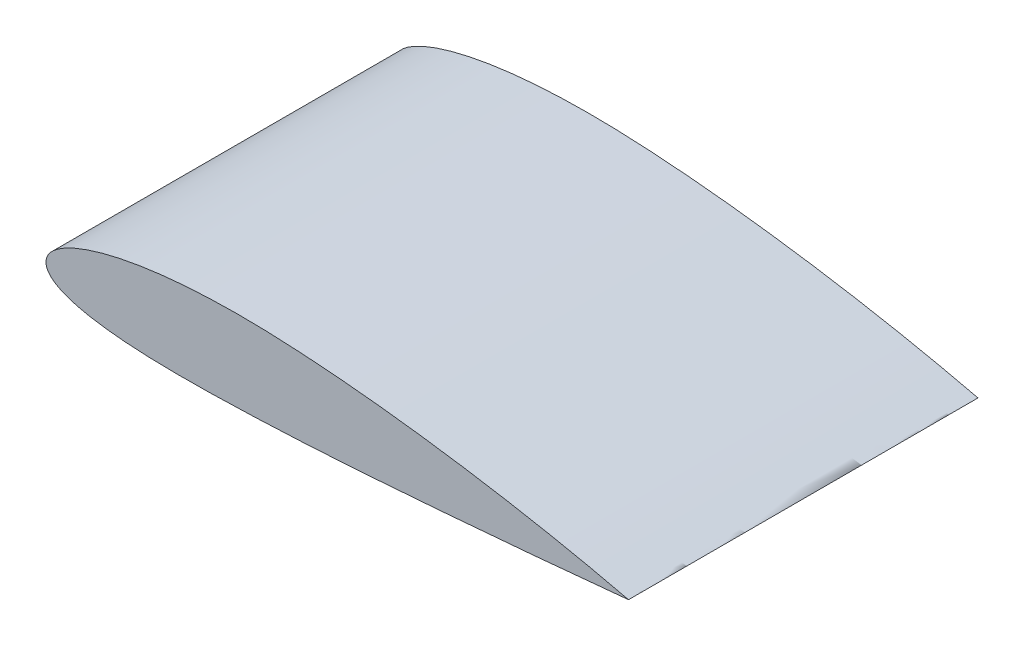
ISO-10303-21;
HEADER;
FILE_DESCRIPTION(('STEP AP214'),'2;1');
FILE_NAME('part.step','',(''),(''),'','','');
FILE_SCHEMA(('AUTOMOTIVE_DESIGN { 1 0 10303 214 1 1 1 1 }'));
ENDSEC;
DATA;
#1=APPLICATION_CONTEXT('core data for automotive mechanical design processes');
#2=APPLICATION_PROTOCOL_DEFINITION('international standard','automotive_design',2000,#1);
#3=PRODUCT_CONTEXT('',#1,'mechanical');
#4=PRODUCT('Part','Part','',(#3));
#5=PRODUCT_RELATED_PRODUCT_CATEGORY('part','',(#4));
#6=PRODUCT_DEFINITION_FORMATION('','',#4);
#7=PRODUCT_DEFINITION_CONTEXT('part definition',#1,'design');
#8=PRODUCT_DEFINITION('design','',#6,#7);
#9=PRODUCT_DEFINITION_SHAPE('','',#8);
#10=(LENGTH_UNIT() NAMED_UNIT(*) SI_UNIT(.MILLI.,.METRE.));
#11=(NAMED_UNIT(*) PLANE_ANGLE_UNIT() SI_UNIT($,.RADIAN.));
#12=(NAMED_UNIT(*) SI_UNIT($,.STERADIAN.) SOLID_ANGLE_UNIT());
#13=UNCERTAINTY_MEASURE_WITH_UNIT(LENGTH_MEASURE(1.E-05),#10,'distance_accuracy_value','');
#14=(GEOMETRIC_REPRESENTATION_CONTEXT(3) GLOBAL_UNCERTAINTY_ASSIGNED_CONTEXT((#13)) GLOBAL_UNIT_ASSIGNED_CONTEXT((#10,
#11,#12)) REPRESENTATION_CONTEXT('',''));
#15=CARTESIAN_POINT('',(0.,0.,0.));
#16=DIRECTION('',(0.,0.,1.));
#17=DIRECTION('',(1.,0.,0.));
#18=AXIS2_PLACEMENT_3D('',#15,#16,#17);
#19=CARTESIAN_POINT('',(150.,0.,90.));
#20=CARTESIAN_POINT('',(150.000128592394,0.00207197176119054,90.));
#21=CARTESIAN_POINT('',(149.921286381414,0.0156762670839637,90.));
#22=CARTESIAN_POINT('',(149.840618533519,0.0400471952402206,90.));
#23=CARTESIAN_POINT('',(149.641362995043,0.0846186664771811,90.));
#24=CARTESIAN_POINT('',(149.393057546676,0.144576152827126,90.));
#25=CARTESIAN_POINT('',(149.062063465987,0.222816135034551,90.));
#26=CARTESIAN_POINT('',(148.662478931329,0.316997243388393,90.));
#27=CARTESIAN_POINT('',(148.189654994556,0.428301766036534,90.));
#28=CARTESIAN_POINT('',(147.645740063505,0.555312571828343,90.));
#29=CARTESIAN_POINT('',(147.030715545027,0.698487644191383,90.));
#30=CARTESIAN_POINT('',(146.345188073157,0.85678795898993,90.));
#31=CARTESIAN_POINT('',(145.589777166898,1.02991038074003,90.));
#32=CARTESIAN_POINT('',(144.765273715445,1.21771459392687,90.));
#33=CARTESIAN_POINT('',(143.872413979352,1.4194023658718,90.));
#34=CARTESIAN_POINT('',(142.911920265599,1.63423906695701,90.));
#35=CARTESIAN_POINT('',(141.884816232876,1.86190790814578,90.));
#36=CARTESIAN_POINT('',(140.791958890963,2.10143686601098,90.));
#37=CARTESIAN_POINT('',(139.634475666377,2.35270967628724,90.));
#38=CARTESIAN_POINT('',(138.413280736817,2.61445237668105,90.));
#39=CARTESIAN_POINT('',(137.129613155064,2.88632597762713,90.));
#40=CARTESIAN_POINT('',(135.784670535301,3.16743412242775,90.));
#41=CARTESIAN_POINT('',(134.379770639112,3.45735336948529,90.));
#42=CARTESIAN_POINT('',(132.9161360637,3.75496046389908,90.));
#43=CARTESIAN_POINT('',(131.395163864362,4.05968375773513,90.));
#44=CARTESIAN_POINT('',(129.818310411048,4.37060302861979,90.));
#45=CARTESIAN_POINT('',(128.18710134998,4.68735342304156,90.));
#46=CARTESIAN_POINT('',(126.503082814844,5.00886677414356,90.));
#47=CARTESIAN_POINT('',(124.767807151878,5.3341279501105,90.));
#48=CARTESIAN_POINT('',(122.983084740532,5.66315451041354,90.));
#49=CARTESIAN_POINT('',(121.150450210213,5.99407609610609,90.));
#50=CARTESIAN_POINT('',(119.271772564735,6.32701286428955,90.));
#51=CARTESIAN_POINT('',(117.348862248889,6.66101413827002,90.));
#52=CARTESIAN_POINT('',(115.38345288509,6.99488813953102,90.));
#53=CARTESIAN_POINT('',(113.377515944814,7.32824888473106,90.));
#54=CARTESIAN_POINT('',(111.333035335355,7.66026083674251,90.));
#55=CARTESIAN_POINT('',(109.251928889209,7.98996875891814,90.));
#56=CARTESIAN_POINT('',(107.136350406203,8.31691563524391,90.));
#57=CARTESIAN_POINT('',(104.988240728006,8.64001782043545,90.));
#58=CARTESIAN_POINT('',(102.809810878505,8.95888224367585,90.));
#59=CARTESIAN_POINT('',(100.60305139377,9.27240468022896,90.));
#60=CARTESIAN_POINT('',(98.3702639008951,9.58014558520131,90.));
#61=CARTESIAN_POINT('',(96.1135680151674,9.8811461356426,90.));
#62=CARTESIAN_POINT('',(93.8352065817292,10.1745903071041,90.));
#63=CARTESIAN_POINT('',(91.5374067106514,10.4599904941657,90.));
#64=CARTESIAN_POINT('',(89.2224528585404,10.7365279827745,90.));
#65=CARTESIAN_POINT('',(86.8927109391122,11.0035496544728,90.));
#66=CARTESIAN_POINT('',(84.5504337738937,11.2599272016814,90.));
#67=CARTESIAN_POINT('',(82.1980308825486,11.5055028127237,90.));
#68=CARTESIAN_POINT('',(79.8377589899001,11.7392678472883,90.));
#69=CARTESIAN_POINT('',(77.4720193182466,11.9609745220418,90.));
#70=CARTESIAN_POINT('',(75.103116251629,12.1689604901954,90.));
#71=CARTESIAN_POINT('',(72.733570487531,12.3638556733871,90.));
#72=CARTESIAN_POINT('',(70.3656333410541,12.5439619039913,90.));
#73=CARTESIAN_POINT('',(68.0017472286094,12.7091035741317,90.));
#74=CARTESIAN_POINT('',(65.644320807281,12.8589185063334,90.));
#75=CARTESIAN_POINT('',(63.2957800126871,12.9924568527596,90.));
#76=CARTESIAN_POINT('',(60.9541598463589,13.1095348623224,90.));
#77=CARTESIAN_POINT('',(58.6188201340624,13.2091378765701,90.));
#78=CARTESIAN_POINT('',(56.2919620624312,13.2854071035843,90.));
#79=CARTESIAN_POINT('',(53.9804093139093,13.3391488693031,90.));
#80=CARTESIAN_POINT('',(51.6894948060767,13.3695491993917,90.));
#81=CARTESIAN_POINT('',(49.4216752106531,13.3765929469494,90.));
#82=CARTESIAN_POINT('',(47.1793461869603,13.3601495087651,90.));
#83=CARTESIAN_POINT('',(44.9650157088471,13.3198752163367,90.));
#84=CARTESIAN_POINT('',(42.780921966315,13.2563712807262,90.));
#85=CARTESIAN_POINT('',(40.6294653699928,13.1693464700625,90.));
#86=CARTESIAN_POINT('',(38.5129239059003,13.0585667062003,90.));
#87=CARTESIAN_POINT('',(36.4335948969937,12.9251436980446,90.));
#88=CARTESIAN_POINT('',(34.3937380881506,12.7685277743742,90.));
#89=CARTESIAN_POINT('',(32.395439512031,12.5898101224116,90.));
#90=CARTESIAN_POINT('',(30.4409654429754,12.3887240815787,90.));
#91=CARTESIAN_POINT('',(28.532263661356,12.1662858815515,90.));
#92=CARTESIAN_POINT('',(26.6713847284961,11.922938652211,90.));
#93=CARTESIAN_POINT('',(24.8603454665422,11.6588893062561,90.));
#94=CARTESIAN_POINT('',(23.1010027714418,11.3754839646862,90.));
#95=CARTESIAN_POINT('',(21.3952312539354,11.0732307085384,90.));
#96=CARTESIAN_POINT('',(19.7447903882117,10.7525809239843,90.));
#97=CARTESIAN_POINT('',(18.1513100119793,10.4147626842155,90.));
#98=CARTESIAN_POINT('',(16.616465426156,10.0607191244245,90.));
#99=CARTESIAN_POINT('',(15.1418582696448,9.69091716799794,90.));
#100=CARTESIAN_POINT('',(13.7289370226268,9.3067253106132,90.));
#101=CARTESIAN_POINT('',(12.3790231623339,8.90910925951885,90.));
#102=CARTESIAN_POINT('',(11.0936518369081,8.49853491041602,90.));
#103=CARTESIAN_POINT('',(9.87373376587554,8.07694806484605,90.));
#104=CARTESIAN_POINT('',(8.72072521013741,7.64438841006556,90.));
#105=CARTESIAN_POINT('',(7.63543166368263,7.20276088763796,90.));
#106=CARTESIAN_POINT('',(6.61915181968241,6.75219437002339,90.));
#107=CARTESIAN_POINT('',(5.67256428686346,6.29424603821434,90.));
#108=CARTESIAN_POINT('',(4.79642792503662,5.82980259989536,90.));
#109=CARTESIAN_POINT('',(3.99173828864941,5.35939593426927,90.));
#110=CARTESIAN_POINT('',(3.2588659990024,4.88433864903243,90.));
#111=CARTESIAN_POINT('',(2.59855787710264,4.40520869694353,90.));
#112=CARTESIAN_POINT('',(2.01123439575519,3.92262157316899,90.));
#113=CARTESIAN_POINT('',(1.49726883366959,3.4373582175078,90.));
#114=CARTESIAN_POINT('',(1.05696070671597,2.94985336364509,90.));
#115=CARTESIAN_POINT('',(0.690746495341547,2.46051133988989,90.));
#116=CARTESIAN_POINT('',(0.398832448033842,1.96959444811213,90.));
#117=CARTESIAN_POINT('',(0.182376719942572,1.47713234320214,90.));
#118=CARTESIAN_POINT('',(0.0409348927729238,0.983811867861635,90.));
#119=CARTESIAN_POINT('',(-0.0239297619203336,0.489948468708132,90.));
#120=CARTESIAN_POINT('',(-0.0123370773547969,-0.00124485911004259,90.));
#121=CARTESIAN_POINT('',(0.0735181466740347,-0.484950952318647,90.));
#122=CARTESIAN_POINT('',(0.234733941881718,-0.956084639515778,90.));
#123=CARTESIAN_POINT('',(0.46947891536452,-1.41200817154394,90.));
#124=CARTESIAN_POINT('',(0.777444415165616,-1.85213608695574,90.));
#125=CARTESIAN_POINT('',(1.15716027053235,-2.2766793133391,90.));
#126=CARTESIAN_POINT('',(1.60788224521962,-2.68584751444184,90.));
#127=CARTESIAN_POINT('',(2.12903010412471,-3.07968646870409,90.));
#128=CARTESIAN_POINT('',(2.7199324240579,-3.45833060477207,90.));
#129=CARTESIAN_POINT('',(3.37998367360147,-3.82159349664593,90.));
#130=CARTESIAN_POINT('',(4.10842515178642,-4.16955468450257,90.));
#131=CARTESIAN_POINT('',(4.90444554813824,-4.50210091705735,90.));
#132=CARTESIAN_POINT('',(5.76724747548645,-4.81926309744364,90.));
#133=CARTESIAN_POINT('',(6.69604001161117,-5.12027814268574,90.));
#134=CARTESIAN_POINT('',(7.689629218434,-5.40586828134426,90.));
#135=CARTESIAN_POINT('',(8.74713972943778,-5.67535946236537,90.));
#136=CARTESIAN_POINT('',(9.86745718068461,-5.92867605322096,90.));
#137=CARTESIAN_POINT('',(11.0493767224631,-6.16587886782768,90.));
#138=CARTESIAN_POINT('',(12.2917064704521,-6.3869846311384,90.));
#139=CARTESIAN_POINT('',(13.593282331002,-6.59179246265019,90.));
#140=CARTESIAN_POINT('',(14.9528000707615,-6.77998652551478,90.));
#141=CARTESIAN_POINT('',(16.3688344075672,-6.95221957346764,90.));
#142=CARTESIAN_POINT('',(17.8400553935342,-7.10816219287833,90.));
#143=CARTESIAN_POINT('',(19.3650813382236,-7.24819731316726,90.));
#144=CARTESIAN_POINT('',(20.9424009187069,-7.37208870244096,90.));
#145=CARTESIAN_POINT('',(22.5705344897251,-7.48039302406842,90.));
#146=CARTESIAN_POINT('',(24.247963439121,-7.57296559277852,90.));
#147=CARTESIAN_POINT('',(25.9731112755281,-7.65059073759202,90.));
#148=CARTESIAN_POINT('',(27.7443575081067,-7.71304273619092,90.));
#149=CARTESIAN_POINT('',(29.5600789139127,-7.76133071311778,90.));
#150=CARTESIAN_POINT('',(31.4186973574262,-7.79520163131238,90.));
#151=CARTESIAN_POINT('',(33.3184514148309,-7.81554835479094,90.));
#152=CARTESIAN_POINT('',(35.2575972457435,-7.82265635797185,90.));
#153=CARTESIAN_POINT('',(37.2343834709581,-7.81718132287392,90.));
#154=CARTESIAN_POINT('',(39.2470640385047,-7.79980642569612,90.));
#155=CARTESIAN_POINT('',(41.2938335563393,-7.77072574571862,90.));
#156=CARTESIAN_POINT('',(43.3728517247793,-7.73117821342518,90.));
#157=CARTESIAN_POINT('',(45.4822147023104,-7.68140753458189,90.));
#158=CARTESIAN_POINT('',(47.6200635084368,-7.62188615324917,90.));
#159=CARTESIAN_POINT('',(49.7844210857099,-7.55406589099875,90.));
#160=CARTESIAN_POINT('',(51.9734177187001,-7.47799882913962,90.));
#161=CARTESIAN_POINT('',(54.185012831249,-7.39464518964275,90.));
#162=CARTESIAN_POINT('',(56.4172532268059,-7.30468827820494,90.));
#163=CARTESIAN_POINT('',(58.6709883385465,-7.20874227625813,90.));
#164=CARTESIAN_POINT('',(60.9485237222044,-7.10839049806885,90.));
#165=CARTESIAN_POINT('',(63.2473918721584,-6.99888870305007,90.));
#166=CARTESIAN_POINT('',(65.5625001895295,-6.88085296631029,90.));
#167=CARTESIAN_POINT('',(67.8872916777317,-6.75458630227251,90.));
#168=CARTESIAN_POINT('',(70.2195897163212,-6.62108470871015,90.));
#169=CARTESIAN_POINT('',(72.55712483294,-6.48070482324664,90.));
#170=CARTESIAN_POINT('',(74.8976325598512,-6.33456563099564,90.));
#171=CARTESIAN_POINT('',(77.23885784993,-6.18244268732993,90.));
#172=CARTESIAN_POINT('',(79.578513463044,-6.02580406677088,90.));
#173=CARTESIAN_POINT('',(81.9143446096754,-5.86446652816794,90.));
#174=CARTESIAN_POINT('',(84.2440814391245,-5.69943623336202,90.));
#175=CARTESIAN_POINT('',(86.5654915771556,-5.53143244303565,90.));
#176=CARTESIAN_POINT('',(88.8762096125681,-5.3601167220515,90.));
#177=CARTESIAN_POINT('',(91.1740710190245,-5.18704124126106,90.));
#178=CARTESIAN_POINT('',(93.4567446577997,-5.0117241212188,90.));
#179=CARTESIAN_POINT('',(95.7221017610399,-4.83544819255654,90.));
#180=CARTESIAN_POINT('',(97.9677943660801,-4.65803593890302,90.));
#181=CARTESIAN_POINT('',(100.191672992336,-4.4799073071679,90.));
#182=CARTESIAN_POINT('',(102.391491555661,-4.30207463279348,90.));
#183=CARTESIAN_POINT('',(104.565060554801,-4.12388579532493,90.));
#184=CARTESIAN_POINT('',(106.710274753025,-3.94675072040054,90.));
#185=CARTESIAN_POINT('',(108.824922824867,-3.77026788429364,90.));
#186=CARTESIAN_POINT('',(110.906949924022,-3.59469030166438,90.));
#187=CARTESIAN_POINT('',(112.95426544643,-3.42101787999728,90.));
#188=CARTESIAN_POINT('',(114.964858120082,-3.24882592062978,90.));
#189=CARTESIAN_POINT('',(116.936655366895,-3.07863908651643,90.));
#190=CARTESIAN_POINT('',(118.867701526445,-2.91069025129094,90.));
#191=CARTESIAN_POINT('',(120.755995548144,-2.74526840991686,90.));
#192=CARTESIAN_POINT('',(122.599706205031,-2.58278514893787,90.));
#193=CARTESIAN_POINT('',(124.396901890887,-2.42308171929845,90.));
#194=CARTESIAN_POINT('',(126.145795974774,-2.26651192000512,90.));
#195=CARTESIAN_POINT('',(127.844599252696,-2.11344457714192,90.));
#196=CARTESIAN_POINT('',(129.491544134053,-1.96393458566807,90.));
#197=CARTESIAN_POINT('',(131.085045118875,-1.81834211703768,90.));
#198=CARTESIAN_POINT('',(132.623341715514,-1.67680183127334,90.));
#199=CARTESIAN_POINT('',(134.104990031065,-1.53958103252525,90.));
#200=CARTESIAN_POINT('',(135.528347057731,-1.40695270976115,90.));
#201=CARTESIAN_POINT('',(136.892025441911,-1.27877044861517,90.));
#202=CARTESIAN_POINT('',(138.194601718358,-1.1559955818733,90.));
#203=CARTESIAN_POINT('',(139.434669206243,-1.03780141710451,90.));
#204=CARTESIAN_POINT('',(140.611045435554,-0.925523422428981,90.));
#205=CARTESIAN_POINT('',(141.72241303775,-0.818285118277217,90.));
#206=CARTESIAN_POINT('',(142.76768655267,-0.717376632036449,90.));
#207=CARTESIAN_POINT('',(143.745721836126,-0.6220744121157,90.));
#208=CARTESIAN_POINT('',(144.655477517554,-0.53307763524739,90.));
#209=CARTESIAN_POINT('',(145.496062069118,-0.450230919733664,90.));
#210=CARTESIAN_POINT('',(146.266518413234,-0.374107807195919,90.));
#211=CARTESIAN_POINT('',(146.966099410114,-0.304634113649397,90.));
#212=CARTESIAN_POINT('',(147.594047693526,-0.242194548516185,90.));
#213=CARTESIAN_POINT('',(148.149564409851,-0.186467258798322,90.));
#214=CARTESIAN_POINT('',(148.632674253206,-0.138120416767816,90.));
#215=CARTESIAN_POINT('',(149.040994190488,-0.0968068602923004,90.));
#216=CARTESIAN_POINT('',(149.379329373662,-0.0630827136809254,90.));
#217=CARTESIAN_POINT('',(149.633327539669,-0.0361940295344238,90.));
#218=CARTESIAN_POINT('',(149.836717003475,-0.0184848298275575,90.));
#219=CARTESIAN_POINT('',(149.919884405055,-0.00504051583093539,90.));
#220=CARTESIAN_POINT('',(149.999871177817,-0.00207567428491264,90.));
#221=CARTESIAN_POINT('',(150.,0.,90.));
#222=B_SPLINE_CURVE_WITH_KNOTS('',3,(#19,#20,#21,#22,#23,#24,#25,#26,#27,#28,#29,#30,#31,#32,
#33,#34,#35,#36,#37,#38,#39,#40,#41,#42,#43,#44,#45,#46,#47,#48,#49,#50,#51,#52,#53,#54,#55,#56,
#57,#58,#59,#60,#61,#62,#63,#64,#65,#66,#67,#68,#69,#70,#71,#72,#73,#74,#75,#76,#77,#78,#79,#80,
#81,#82,#83,#84,#85,#86,#87,#88,#89,#90,#91,#92,#93,#94,#95,#96,#97,#98,#99,#100,#101,#102,#103,
#104,#105,#106,#107,#108,#109,#110,#111,#112,#113,#114,#115,#116,#117,#118,#119,#120,#121,#122,
#123,#124,#125,#126,#127,#128,#129,#130,#131,#132,#133,#134,#135,#136,#137,#138,#139,#140,#141,
#142,#143,#144,#145,#146,#147,#148,#149,#150,#151,#152,#153,#154,#155,#156,#157,#158,#159,#160,
#161,#162,#163,#164,#165,#166,#167,#168,#169,#170,#171,#172,#173,#174,#175,#176,#177,#178,#179,
#180,#181,#182,#183,#184,#185,#186,#187,#188,#189,#190,#191,#192,#193,#194,#195,#196,#197,#198,
#199,#200,#201,#202,#203,#204,#205,#206,#207,#208,#209,#210,#211,#212,#213,#214,#215,#216,#217,
#218,#219,#220,#221),.UNSPECIFIED.,.T.,.F.,(4,1,1,1,1,1,1,1,1,1,1,1,1,1,1,1,1,1,1,1,1,1,1,1,1,1,
1,1,1,1,1,1,1,1,1,1,1,1,1,1,1,1,1,1,1,1,1,1,1,1,1,1,1,1,1,1,1,1,1,1,1,1,1,1,1,1,1,1,1,1,1,1,1,1,
1,1,1,1,1,1,1,1,1,1,1,1,1,1,1,1,1,1,1,1,1,1,1,1,1,1,1,1,1,1,1,1,1,1,1,1,1,1,1,1,1,1,1,1,1,1,1,1,
1,1,1,1,1,1,1,1,1,1,1,1,1,1,1,1,1,1,1,1,1,1,1,1,1,1,1,1,1,1,1,1,1,1,1,1,1,1,1,1,1,1,1,1,1,1,1,1,
1,1,1,1,1,1,1,1,1,1,1,1,1,1,1,1,1,1,1,1,1,1,1,1,1,1,1,1,1,1,4),(0.,0.000122162292925126,
0.000488762123664581,0.00109862585249539,0.00195211516338221,0.00304744687672182,
0.00438464649402972,0.00596134481263252,0.00777614938122741,0.00982705468056708,
0.0121126742324979,0.0146303120545412,0.0173769077618876,0.020350611281203,0.0235475710349984,
0.0269651043855758,0.0305993711275513,0.0344467452913506,0.0385037721191401,0.042766258296569,
0.0472294383836978,0.051889129880857,0.0567409607775249,0.0617797125683963,0.0670006523123388,
0.0723981924169577,0.0779675226055414,0.0837024104867699,0.0895973795203477,0.0956469985507951,
0.101844367561367,0.10818433676767,0.114660163537456,0.121265364235741,0.12799386231279,
0.134838072817671,0.141792018423888,0.148848138740283,0.155999994814262,0.163240053489875,
0.170561898138689,0.177957060981604,0.185419088019949,0.192940635895921,0.200513829984268,
0.208131296887094,0.215785145596294,0.223468149077951,0.231172507544831,0.23889097555281,
0.246615713195003,0.254338679343058,0.262052578522177,0.26975030301542,0.27742330581638,
0.28506446310683,0.292666232741377,0.300263366114552,0.307835405473995,0.315345956792699,
0.322787926415998,0.330154754420518,0.337438456129422,0.344632551195919,0.351729592926878,
0.358724149941123,0.365608397213359,0.372376389045862,0.379021837306973,0.385538355839003,
0.391920688633037,0.398161977712991,0.404257920441557,0.410202821136895,0.415990748712251,
0.42161746729893,0.427078333906202,0.432368971849851,0.437485146722796,0.442422347133614,
0.44717829211659,0.451748434541019,0.456130521655789,0.46032233171646,0.464321065117837,
0.468125968603327,0.471735325729275,0.475149044729029,0.478367901141941,0.481393138426946,
0.484226536028113,0.486872777281863,0.489336630074413,0.491626809865717,0.493752608159808,
0.495728374953011,0.497571482258468,0.499304594673128,0.500954467762557,0.502554253237653,
0.504138225097303,0.505722330861526,0.507321369806936,0.508970881835086,0.510701621004601,
0.512540315637855,0.51450827970486,0.516622701322011,0.51889662827842,0.521339375337568,
0.523957652556219,0.526757321878356,0.529740579011165,0.532910335841471,0.536266753505548,
0.53981021696274,0.543540237969794,0.547455024333339,0.551552863268846,0.555832130724536,
0.560290010871719,0.564922704924951,0.56972801828894,0.574702204753771,0.579841337080171,
0.585140964717381,0.590597949476929,0.596207166523907,0.601963840460728,0.607863660176209,
0.613901711742432,0.620073053256334,0.626371697545637,0.632792579579604,0.639330581258792,
0.645979570824225,0.652733842594886,0.659587675868176,0.666534338095336,0.673568484282105,
0.680682850821874,0.687872069430877,0.695128803124031,0.702446649346367,0.70984751864113,
0.717337734487197,0.724867240295389,0.732430231799474,0.740018868367851,0.747625320034982,
0.755243172166993,0.762864144907509,0.770481282659646,0.77808677644171,0.78567368311764,
0.793234112813917,0.800760762712277,0.808246147054295,0.815682956815766,0.823063732044918,
0.830381645526481,0.837628336054659,0.844797828362965,0.851881874906505,0.858873971091258,
0.865767325016509,0.8725540937843,0.879228778169418,0.88578361562576,0.892212702539526,
0.898509163983926,0.90466660968828,0.91067864876577,0.916539946273847,0.922243626074727,
0.927784266895841,0.933156490763343,0.938353905421989,0.943372587931436,0.948205660290561,
0.952849684221836,0.957298796546347,0.961548982517581,0.965595440229777,0.969434107484152,
0.973061152906089,0.976472512095491,0.979664354214839,0.982634162030359,0.985377526014154,
0.987892897122895,0.990176349956677,0.992226382571973,0.994040087190155,0.995616397752643,
0.996952891100085,0.998048064676876,0.998901384954488,0.999511398055231,0.999877619408353,1.),.UNSPECIFIED.);
#223=DIRECTION('',(0.,0.,-1.));
#224=VECTOR('',#223,1.);
#225=SURFACE_OF_LINEAR_EXTRUSION('',#222,#224);
#226=CARTESIAN_POINT('',(150.,0.,90.));
#227=VERTEX_POINT('',#226);
#228=EDGE_CURVE('E10',#227,#227,#222,.T.);
#229=ORIENTED_EDGE('',*,*,#228,.F.);
#230=EDGE_LOOP('',(#229));
#231=FACE_BOUND('',#230,.T.);
#232=CARTESIAN_POINT('',(150.,0.,0.));
#233=CARTESIAN_POINT('',(150.000128592394,0.00207197176119054,0.));
#234=CARTESIAN_POINT('',(149.921286381414,0.0156762670839637,0.));
#235=CARTESIAN_POINT('',(149.840618533519,0.0400471952402206,0.));
#236=CARTESIAN_POINT('',(149.641362995043,0.0846186664771811,0.));
#237=CARTESIAN_POINT('',(149.393057546676,0.144576152827126,0.));
#238=CARTESIAN_POINT('',(149.062063465987,0.222816135034551,0.));
#239=CARTESIAN_POINT('',(148.662478931329,0.316997243388393,0.));
#240=CARTESIAN_POINT('',(148.189654994556,0.428301766036534,0.));
#241=CARTESIAN_POINT('',(147.645740063505,0.555312571828343,0.));
#242=CARTESIAN_POINT('',(147.030715545027,0.698487644191383,0.));
#243=CARTESIAN_POINT('',(146.345188073157,0.85678795898993,0.));
#244=CARTESIAN_POINT('',(145.589777166898,1.02991038074003,0.));
#245=CARTESIAN_POINT('',(144.765273715445,1.21771459392687,0.));
#246=CARTESIAN_POINT('',(143.872413979352,1.4194023658718,0.));
#247=CARTESIAN_POINT('',(142.911920265599,1.63423906695701,0.));
#248=CARTESIAN_POINT('',(141.884816232876,1.86190790814578,0.));
#249=CARTESIAN_POINT('',(140.791958890963,2.10143686601098,0.));
#250=CARTESIAN_POINT('',(139.634475666377,2.35270967628724,0.));
#251=CARTESIAN_POINT('',(138.413280736817,2.61445237668105,0.));
#252=CARTESIAN_POINT('',(137.129613155064,2.88632597762713,0.));
#253=CARTESIAN_POINT('',(135.784670535301,3.16743412242775,0.));
#254=CARTESIAN_POINT('',(134.379770639112,3.45735336948529,0.));
#255=CARTESIAN_POINT('',(132.9161360637,3.75496046389908,0.));
#256=CARTESIAN_POINT('',(131.395163864362,4.05968375773513,0.));
#257=CARTESIAN_POINT('',(129.818310411048,4.37060302861979,0.));
#258=CARTESIAN_POINT('',(128.18710134998,4.68735342304156,0.));
#259=CARTESIAN_POINT('',(126.503082814844,5.00886677414356,0.));
#260=CARTESIAN_POINT('',(124.767807151878,5.3341279501105,0.));
#261=CARTESIAN_POINT('',(122.983084740532,5.66315451041354,0.));
#262=CARTESIAN_POINT('',(121.150450210213,5.99407609610609,0.));
#263=CARTESIAN_POINT('',(119.271772564735,6.32701286428955,0.));
#264=CARTESIAN_POINT('',(117.348862248889,6.66101413827002,0.));
#265=CARTESIAN_POINT('',(115.38345288509,6.99488813953102,0.));
#266=CARTESIAN_POINT('',(113.377515944814,7.32824888473106,0.));
#267=CARTESIAN_POINT('',(111.333035335355,7.66026083674251,0.));
#268=CARTESIAN_POINT('',(109.251928889209,7.98996875891814,0.));
#269=CARTESIAN_POINT('',(107.136350406203,8.31691563524391,0.));
#270=CARTESIAN_POINT('',(104.988240728006,8.64001782043545,0.));
#271=CARTESIAN_POINT('',(102.809810878505,8.95888224367585,0.));
#272=CARTESIAN_POINT('',(100.60305139377,9.27240468022896,0.));
#273=CARTESIAN_POINT('',(98.3702639008951,9.58014558520131,0.));
#274=CARTESIAN_POINT('',(96.1135680151674,9.8811461356426,0.));
#275=CARTESIAN_POINT('',(93.8352065817292,10.1745903071041,0.));
#276=CARTESIAN_POINT('',(91.5374067106514,10.4599904941657,0.));
#277=CARTESIAN_POINT('',(89.2224528585404,10.7365279827745,0.));
#278=CARTESIAN_POINT('',(86.8927109391122,11.0035496544728,0.));
#279=CARTESIAN_POINT('',(84.5504337738937,11.2599272016814,0.));
#280=CARTESIAN_POINT('',(82.1980308825486,11.5055028127237,0.));
#281=CARTESIAN_POINT('',(79.8377589899001,11.7392678472883,0.));
#282=CARTESIAN_POINT('',(77.4720193182466,11.9609745220418,0.));
#283=CARTESIAN_POINT('',(75.103116251629,12.1689604901954,0.));
#284=CARTESIAN_POINT('',(72.733570487531,12.3638556733871,0.));
#285=CARTESIAN_POINT('',(70.3656333410541,12.5439619039913,0.));
#286=CARTESIAN_POINT('',(68.0017472286094,12.7091035741317,0.));
#287=CARTESIAN_POINT('',(65.644320807281,12.8589185063334,0.));
#288=CARTESIAN_POINT('',(63.2957800126871,12.9924568527596,0.));
#289=CARTESIAN_POINT('',(60.9541598463589,13.1095348623224,0.));
#290=CARTESIAN_POINT('',(58.6188201340624,13.2091378765701,0.));
#291=CARTESIAN_POINT('',(56.2919620624312,13.2854071035843,0.));
#292=CARTESIAN_POINT('',(53.9804093139093,13.3391488693031,0.));
#293=CARTESIAN_POINT('',(51.6894948060767,13.3695491993917,0.));
#294=CARTESIAN_POINT('',(49.4216752106531,13.3765929469494,0.));
#295=CARTESIAN_POINT('',(47.1793461869603,13.3601495087651,0.));
#296=CARTESIAN_POINT('',(44.9650157088471,13.3198752163367,0.));
#297=CARTESIAN_POINT('',(42.780921966315,13.2563712807262,0.));
#298=CARTESIAN_POINT('',(40.6294653699928,13.1693464700625,0.));
#299=CARTESIAN_POINT('',(38.5129239059003,13.0585667062003,0.));
#300=CARTESIAN_POINT('',(36.4335948969937,12.9251436980446,0.));
#301=CARTESIAN_POINT('',(34.3937380881506,12.7685277743742,0.));
#302=CARTESIAN_POINT('',(32.395439512031,12.5898101224116,0.));
#303=CARTESIAN_POINT('',(30.4409654429754,12.3887240815787,0.));
#304=CARTESIAN_POINT('',(28.532263661356,12.1662858815515,0.));
#305=CARTESIAN_POINT('',(26.6713847284961,11.922938652211,0.));
#306=CARTESIAN_POINT('',(24.8603454665422,11.6588893062561,0.));
#307=CARTESIAN_POINT('',(23.1010027714418,11.3754839646862,0.));
#308=CARTESIAN_POINT('',(21.3952312539354,11.0732307085384,0.));
#309=CARTESIAN_POINT('',(19.7447903882117,10.7525809239843,0.));
#310=CARTESIAN_POINT('',(18.1513100119793,10.4147626842155,0.));
#311=CARTESIAN_POINT('',(16.616465426156,10.0607191244245,0.));
#312=CARTESIAN_POINT('',(15.1418582696448,9.69091716799794,0.));
#313=CARTESIAN_POINT('',(13.7289370226268,9.3067253106132,0.));
#314=CARTESIAN_POINT('',(12.3790231623339,8.90910925951885,0.));
#315=CARTESIAN_POINT('',(11.0936518369081,8.49853491041602,0.));
#316=CARTESIAN_POINT('',(9.87373376587554,8.07694806484605,0.));
#317=CARTESIAN_POINT('',(8.72072521013741,7.64438841006556,0.));
#318=CARTESIAN_POINT('',(7.63543166368263,7.20276088763796,0.));
#319=CARTESIAN_POINT('',(6.61915181968241,6.75219437002339,0.));
#320=CARTESIAN_POINT('',(5.67256428686346,6.29424603821434,0.));
#321=CARTESIAN_POINT('',(4.79642792503662,5.82980259989536,0.));
#322=CARTESIAN_POINT('',(3.99173828864941,5.35939593426927,0.));
#323=CARTESIAN_POINT('',(3.2588659990024,4.88433864903243,0.));
#324=CARTESIAN_POINT('',(2.59855787710264,4.40520869694353,0.));
#325=CARTESIAN_POINT('',(2.01123439575519,3.92262157316899,0.));
#326=CARTESIAN_POINT('',(1.49726883366959,3.4373582175078,0.));
#327=CARTESIAN_POINT('',(1.05696070671597,2.94985336364509,0.));
#328=CARTESIAN_POINT('',(0.690746495341547,2.46051133988989,0.));
#329=CARTESIAN_POINT('',(0.398832448033842,1.96959444811213,0.));
#330=CARTESIAN_POINT('',(0.182376719942572,1.47713234320214,0.));
#331=CARTESIAN_POINT('',(0.0409348927729238,0.983811867861635,0.));
#332=CARTESIAN_POINT('',(-0.0239297619203336,0.489948468708132,0.));
#333=CARTESIAN_POINT('',(-0.0123370773547969,-0.00124485911004259,0.));
#334=CARTESIAN_POINT('',(0.0735181466740347,-0.484950952318647,0.));
#335=CARTESIAN_POINT('',(0.234733941881718,-0.956084639515778,0.));
#336=CARTESIAN_POINT('',(0.46947891536452,-1.41200817154394,0.));
#337=CARTESIAN_POINT('',(0.777444415165616,-1.85213608695574,0.));
#338=CARTESIAN_POINT('',(1.15716027053235,-2.2766793133391,0.));
#339=CARTESIAN_POINT('',(1.60788224521962,-2.68584751444184,0.));
#340=CARTESIAN_POINT('',(2.12903010412471,-3.07968646870409,0.));
#341=CARTESIAN_POINT('',(2.7199324240579,-3.45833060477207,0.));
#342=CARTESIAN_POINT('',(3.37998367360147,-3.82159349664593,0.));
#343=CARTESIAN_POINT('',(4.10842515178642,-4.16955468450257,0.));
#344=CARTESIAN_POINT('',(4.90444554813824,-4.50210091705735,0.));
#345=CARTESIAN_POINT('',(5.76724747548645,-4.81926309744364,0.));
#346=CARTESIAN_POINT('',(6.69604001161117,-5.12027814268574,0.));
#347=CARTESIAN_POINT('',(7.689629218434,-5.40586828134426,0.));
#348=CARTESIAN_POINT('',(8.74713972943778,-5.67535946236537,0.));
#349=CARTESIAN_POINT('',(9.86745718068461,-5.92867605322096,0.));
#350=CARTESIAN_POINT('',(11.0493767224631,-6.16587886782768,0.));
#351=CARTESIAN_POINT('',(12.2917064704521,-6.3869846311384,0.));
#352=CARTESIAN_POINT('',(13.593282331002,-6.59179246265019,0.));
#353=CARTESIAN_POINT('',(14.9528000707615,-6.77998652551478,0.));
#354=CARTESIAN_POINT('',(16.3688344075672,-6.95221957346764,0.));
#355=CARTESIAN_POINT('',(17.8400553935342,-7.10816219287833,0.));
#356=CARTESIAN_POINT('',(19.3650813382236,-7.24819731316726,0.));
#357=CARTESIAN_POINT('',(20.9424009187069,-7.37208870244096,0.));
#358=CARTESIAN_POINT('',(22.5705344897251,-7.48039302406842,0.));
#359=CARTESIAN_POINT('',(24.247963439121,-7.57296559277852,0.));
#360=CARTESIAN_POINT('',(25.9731112755281,-7.65059073759202,0.));
#361=CARTESIAN_POINT('',(27.7443575081067,-7.71304273619092,0.));
#362=CARTESIAN_POINT('',(29.5600789139127,-7.76133071311778,0.));
#363=CARTESIAN_POINT('',(31.4186973574262,-7.79520163131238,0.));
#364=CARTESIAN_POINT('',(33.3184514148309,-7.81554835479094,0.));
#365=CARTESIAN_POINT('',(35.2575972457435,-7.82265635797185,0.));
#366=CARTESIAN_POINT('',(37.2343834709581,-7.81718132287392,0.));
#367=CARTESIAN_POINT('',(39.2470640385047,-7.79980642569612,0.));
#368=CARTESIAN_POINT('',(41.2938335563393,-7.77072574571862,0.));
#369=CARTESIAN_POINT('',(43.3728517247793,-7.73117821342518,0.));
#370=CARTESIAN_POINT('',(45.4822147023104,-7.68140753458189,0.));
#371=CARTESIAN_POINT('',(47.6200635084368,-7.62188615324917,0.));
#372=CARTESIAN_POINT('',(49.7844210857099,-7.55406589099875,0.));
#373=CARTESIAN_POINT('',(51.9734177187001,-7.47799882913962,0.));
#374=CARTESIAN_POINT('',(54.185012831249,-7.39464518964275,0.));
#375=CARTESIAN_POINT('',(56.4172532268059,-7.30468827820494,0.));
#376=CARTESIAN_POINT('',(58.6709883385465,-7.20874227625813,0.));
#377=CARTESIAN_POINT('',(60.9485237222044,-7.10839049806885,0.));
#378=CARTESIAN_POINT('',(63.2473918721584,-6.99888870305007,0.));
#379=CARTESIAN_POINT('',(65.5625001895295,-6.88085296631029,0.));
#380=CARTESIAN_POINT('',(67.8872916777317,-6.75458630227251,0.));
#381=CARTESIAN_POINT('',(70.2195897163212,-6.62108470871015,0.));
#382=CARTESIAN_POINT('',(72.55712483294,-6.48070482324664,0.));
#383=CARTESIAN_POINT('',(74.8976325598512,-6.33456563099564,0.));
#384=CARTESIAN_POINT('',(77.23885784993,-6.18244268732993,0.));
#385=CARTESIAN_POINT('',(79.578513463044,-6.02580406677088,0.));
#386=CARTESIAN_POINT('',(81.9143446096754,-5.86446652816794,0.));
#387=CARTESIAN_POINT('',(84.2440814391245,-5.69943623336202,0.));
#388=CARTESIAN_POINT('',(86.5654915771556,-5.53143244303565,0.));
#389=CARTESIAN_POINT('',(88.8762096125681,-5.3601167220515,0.));
#390=CARTESIAN_POINT('',(91.1740710190245,-5.18704124126106,0.));
#391=CARTESIAN_POINT('',(93.4567446577997,-5.0117241212188,0.));
#392=CARTESIAN_POINT('',(95.7221017610399,-4.83544819255654,0.));
#393=CARTESIAN_POINT('',(97.9677943660801,-4.65803593890302,0.));
#394=CARTESIAN_POINT('',(100.191672992336,-4.4799073071679,0.));
#395=CARTESIAN_POINT('',(102.391491555661,-4.30207463279348,0.));
#396=CARTESIAN_POINT('',(104.565060554801,-4.12388579532493,0.));
#397=CARTESIAN_POINT('',(106.710274753025,-3.94675072040054,0.));
#398=CARTESIAN_POINT('',(108.824922824867,-3.77026788429364,0.));
#399=CARTESIAN_POINT('',(110.906949924022,-3.59469030166438,0.));
#400=CARTESIAN_POINT('',(112.95426544643,-3.42101787999728,0.));
#401=CARTESIAN_POINT('',(114.964858120082,-3.24882592062978,0.));
#402=CARTESIAN_POINT('',(116.936655366895,-3.07863908651643,0.));
#403=CARTESIAN_POINT('',(118.867701526445,-2.91069025129094,0.));
#404=CARTESIAN_POINT('',(120.755995548144,-2.74526840991686,0.));
#405=CARTESIAN_POINT('',(122.599706205031,-2.58278514893787,0.));
#406=CARTESIAN_POINT('',(124.396901890887,-2.42308171929845,0.));
#407=CARTESIAN_POINT('',(126.145795974774,-2.26651192000512,0.));
#408=CARTESIAN_POINT('',(127.844599252696,-2.11344457714192,0.));
#409=CARTESIAN_POINT('',(129.491544134053,-1.96393458566807,0.));
#410=CARTESIAN_POINT('',(131.085045118875,-1.81834211703768,0.));
#411=CARTESIAN_POINT('',(132.623341715514,-1.67680183127334,0.));
#412=CARTESIAN_POINT('',(134.104990031065,-1.53958103252525,0.));
#413=CARTESIAN_POINT('',(135.528347057731,-1.40695270976115,0.));
#414=CARTESIAN_POINT('',(136.892025441911,-1.27877044861517,0.));
#415=CARTESIAN_POINT('',(138.194601718358,-1.1559955818733,0.));
#416=CARTESIAN_POINT('',(139.434669206243,-1.03780141710451,0.));
#417=CARTESIAN_POINT('',(140.611045435554,-0.925523422428981,0.));
#418=CARTESIAN_POINT('',(141.72241303775,-0.818285118277217,0.));
#419=CARTESIAN_POINT('',(142.76768655267,-0.717376632036449,0.));
#420=CARTESIAN_POINT('',(143.745721836126,-0.6220744121157,0.));
#421=CARTESIAN_POINT('',(144.655477517554,-0.53307763524739,0.));
#422=CARTESIAN_POINT('',(145.496062069118,-0.450230919733664,0.));
#423=CARTESIAN_POINT('',(146.266518413234,-0.374107807195919,0.));
#424=CARTESIAN_POINT('',(146.966099410114,-0.304634113649397,0.));
#425=CARTESIAN_POINT('',(147.594047693526,-0.242194548516185,0.));
#426=CARTESIAN_POINT('',(148.149564409851,-0.186467258798322,0.));
#427=CARTESIAN_POINT('',(148.632674253206,-0.138120416767816,0.));
#428=CARTESIAN_POINT('',(149.040994190488,-0.0968068602923004,0.));
#429=CARTESIAN_POINT('',(149.379329373662,-0.0630827136809254,0.));
#430=CARTESIAN_POINT('',(149.633327539669,-0.0361940295344238,0.));
#431=CARTESIAN_POINT('',(149.836717003475,-0.0184848298275575,0.));
#432=CARTESIAN_POINT('',(149.919884405055,-0.00504051583093539,0.));
#433=CARTESIAN_POINT('',(149.999871177817,-0.00207567428491264,0.));
#434=CARTESIAN_POINT('',(150.,0.,0.));
#435=B_SPLINE_CURVE_WITH_KNOTS('',3,(#232,#233,#234,#235,#236,#237,#238,#239,#240,#241,#242,
#243,#244,#245,#246,#247,#248,#249,#250,#251,#252,#253,#254,#255,#256,#257,#258,#259,#260,#261,
#262,#263,#264,#265,#266,#267,#268,#269,#270,#271,#272,#273,#274,#275,#276,#277,#278,#279,#280,
#281,#282,#283,#284,#285,#286,#287,#288,#289,#290,#291,#292,#293,#294,#295,#296,#297,#298,#299,
#300,#301,#302,#303,#304,#305,#306,#307,#308,#309,#310,#311,#312,#313,#314,#315,#316,#317,#318,
#319,#320,#321,#322,#323,#324,#325,#326,#327,#328,#329,#330,#331,#332,#333,#334,#335,#336,#337,
#338,#339,#340,#341,#342,#343,#344,#345,#346,#347,#348,#349,#350,#351,#352,#353,#354,#355,#356,
#357,#358,#359,#360,#361,#362,#363,#364,#365,#366,#367,#368,#369,#370,#371,#372,#373,#374,#375,
#376,#377,#378,#379,#380,#381,#382,#383,#384,#385,#386,#387,#388,#389,#390,#391,#392,#393,#394,
#395,#396,#397,#398,#399,#400,#401,#402,#403,#404,#405,#406,#407,#408,#409,#410,#411,#412,#413,
#414,#415,#416,#417,#418,#419,#420,#421,#422,#423,#424,#425,#426,#427,#428,#429,#430,#431,#432,
#433,#434),.UNSPECIFIED.,.T.,.F.,(4,1,1,1,1,1,1,1,1,1,1,1,1,1,1,1,1,1,1,1,1,1,1,1,1,1,1,1,1,1,1,
1,1,1,1,1,1,1,1,1,1,1,1,1,1,1,1,1,1,1,1,1,1,1,1,1,1,1,1,1,1,1,1,1,1,1,1,1,1,1,1,1,1,1,1,1,1,1,1,
1,1,1,1,1,1,1,1,1,1,1,1,1,1,1,1,1,1,1,1,1,1,1,1,1,1,1,1,1,1,1,1,1,1,1,1,1,1,1,1,1,1,1,1,1,1,1,1,
1,1,1,1,1,1,1,1,1,1,1,1,1,1,1,1,1,1,1,1,1,1,1,1,1,1,1,1,1,1,1,1,1,1,1,1,1,1,1,1,1,1,1,1,1,1,1,1,
1,1,1,1,1,1,1,1,1,1,1,1,1,1,1,1,1,1,1,1,1,1,1,1,1,4),(0.,0.000122162292925126,
0.000488762123664581,0.00109862585249539,0.00195211516338221,0.00304744687672182,
0.00438464649402972,0.00596134481263252,0.00777614938122741,0.00982705468056708,
0.0121126742324979,0.0146303120545412,0.0173769077618876,0.020350611281203,0.0235475710349984,
0.0269651043855758,0.0305993711275513,0.0344467452913506,0.0385037721191401,0.042766258296569,
0.0472294383836978,0.051889129880857,0.0567409607775249,0.0617797125683963,0.0670006523123388,
0.0723981924169577,0.0779675226055414,0.0837024104867699,0.0895973795203477,0.0956469985507951,
0.101844367561367,0.10818433676767,0.114660163537456,0.121265364235741,0.12799386231279,
0.134838072817671,0.141792018423888,0.148848138740283,0.155999994814262,0.163240053489875,
0.170561898138689,0.177957060981604,0.185419088019949,0.192940635895921,0.200513829984268,
0.208131296887094,0.215785145596294,0.223468149077951,0.231172507544831,0.23889097555281,
0.246615713195003,0.254338679343058,0.262052578522177,0.26975030301542,0.27742330581638,
0.28506446310683,0.292666232741377,0.300263366114552,0.307835405473995,0.315345956792699,
0.322787926415998,0.330154754420518,0.337438456129422,0.344632551195919,0.351729592926878,
0.358724149941123,0.365608397213359,0.372376389045862,0.379021837306973,0.385538355839003,
0.391920688633037,0.398161977712991,0.404257920441557,0.410202821136895,0.415990748712251,
0.42161746729893,0.427078333906202,0.432368971849851,0.437485146722796,0.442422347133614,
0.44717829211659,0.451748434541019,0.456130521655789,0.46032233171646,0.464321065117837,
0.468125968603327,0.471735325729275,0.475149044729029,0.478367901141941,0.481393138426946,
0.484226536028113,0.486872777281863,0.489336630074413,0.491626809865717,0.493752608159808,
0.495728374953011,0.497571482258468,0.499304594673128,0.500954467762557,0.502554253237653,
0.504138225097303,0.505722330861526,0.507321369806936,0.508970881835086,0.510701621004601,
0.512540315637855,0.51450827970486,0.516622701322011,0.51889662827842,0.521339375337568,
0.523957652556219,0.526757321878356,0.529740579011165,0.532910335841471,0.536266753505548,
0.53981021696274,0.543540237969794,0.547455024333339,0.551552863268846,0.555832130724536,
0.560290010871719,0.564922704924951,0.56972801828894,0.574702204753771,0.579841337080171,
0.585140964717381,0.590597949476929,0.596207166523907,0.601963840460728,0.607863660176209,
0.613901711742432,0.620073053256334,0.626371697545637,0.632792579579604,0.639330581258792,
0.645979570824225,0.652733842594886,0.659587675868176,0.666534338095336,0.673568484282105,
0.680682850821874,0.687872069430877,0.695128803124031,0.702446649346367,0.70984751864113,
0.717337734487197,0.724867240295389,0.732430231799474,0.740018868367851,0.747625320034982,
0.755243172166993,0.762864144907509,0.770481282659646,0.77808677644171,0.78567368311764,
0.793234112813917,0.800760762712277,0.808246147054295,0.815682956815766,0.823063732044918,
0.830381645526481,0.837628336054659,0.844797828362965,0.851881874906505,0.858873971091258,
0.865767325016509,0.8725540937843,0.879228778169418,0.88578361562576,0.892212702539526,
0.898509163983926,0.90466660968828,0.91067864876577,0.916539946273847,0.922243626074727,
0.927784266895841,0.933156490763343,0.938353905421989,0.943372587931436,0.948205660290561,
0.952849684221836,0.957298796546347,0.961548982517581,0.965595440229777,0.969434107484152,
0.973061152906089,0.976472512095491,0.979664354214839,0.982634162030359,0.985377526014154,
0.987892897122895,0.990176349956677,0.992226382571973,0.994040087190155,0.995616397752643,
0.996952891100085,0.998048064676876,0.998901384954488,0.999511398055231,0.999877619408353,1.),.UNSPECIFIED.);
#436=CARTESIAN_POINT('',(150.,0.,0.));
#437=VERTEX_POINT('',#436);
#438=EDGE_CURVE('E47',#437,#437,#435,.T.);
#439=ORIENTED_EDGE('',*,*,#438,.T.);
#440=EDGE_LOOP('',(#439));
#441=FACE_BOUND('',#440,.T.);
#442=ADVANCED_FACE('F43',(#231,#441),#225,.F.);
#443=CARTESIAN_POINT('',(0.123763169464209,1.26140252840416,90.));
#444=DIRECTION('',(0.,0.,-1.));
#445=DIRECTION('',(-1.,0.,0.));
#446=AXIS2_PLACEMENT_3D('',#443,#444,#445);
#447=PLANE('',#446);
#448=ORIENTED_EDGE('',*,*,#228,.T.);
#449=EDGE_LOOP('',(#448));
#450=FACE_BOUND('',#449,.T.);
#451=ADVANCED_FACE('F68',(#450),#447,.F.);
#452=CARTESIAN_POINT('',(0.123763169464209,1.26140252840416,0.));
#453=DIRECTION('',(0.,0.,-1.));
#454=DIRECTION('',(-1.,0.,0.));
#455=AXIS2_PLACEMENT_3D('',#452,#453,#454);
#456=PLANE('',#455);
#457=ORIENTED_EDGE('',*,*,#438,.F.);
#458=EDGE_LOOP('',(#457));
#459=FACE_BOUND('',#458,.T.);
#460=ADVANCED_FACE('F66',(#459),#456,.T.);
#461=CLOSED_SHELL('',(#442,#451,#460));
#462=MANIFOLD_SOLID_BREP('B2',#461);
#463=ADVANCED_BREP_SHAPE_REPRESENTATION('',(#18,#462),#14);
#464=SHAPE_DEFINITION_REPRESENTATION(#9,#463);
ENDSEC;
END-ISO-10303-21;
